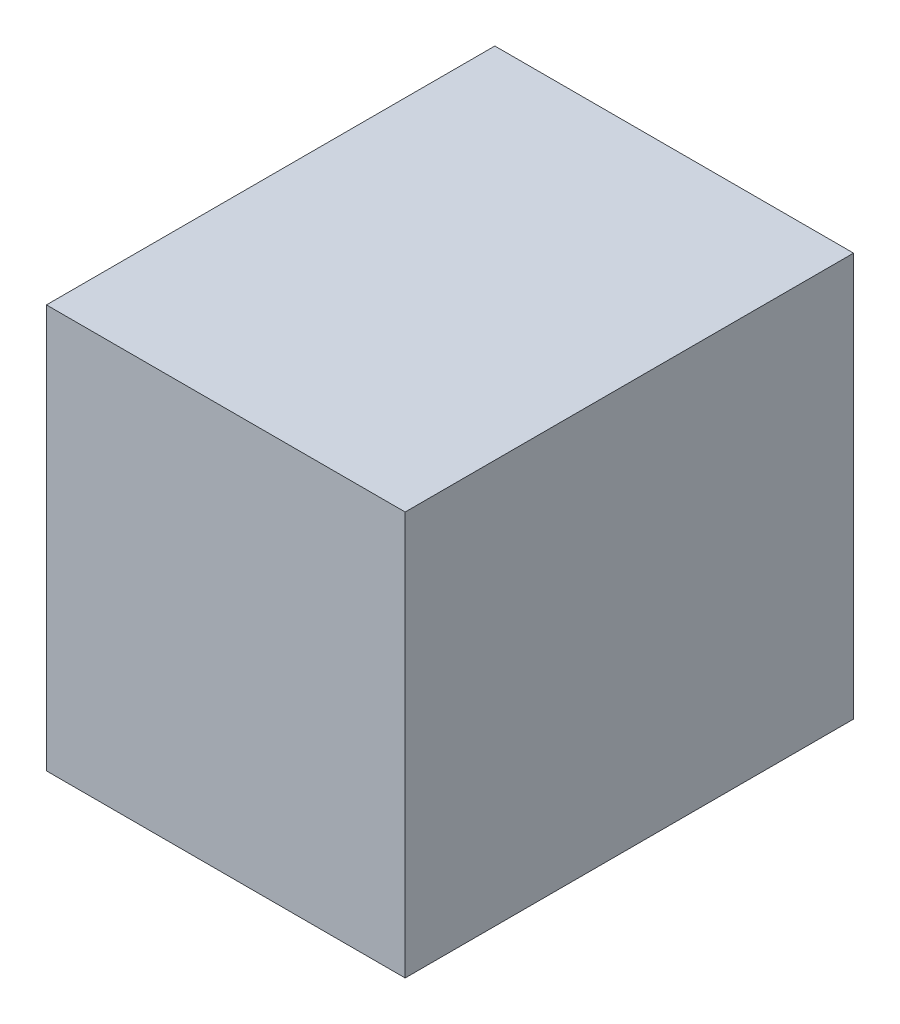
ISO-10303-21;
HEADER;
FILE_DESCRIPTION(('STEP AP214'),'2;1');
FILE_NAME('part.step','',(''),(''),'','','');
FILE_SCHEMA(('AUTOMOTIVE_DESIGN { 1 0 10303 214 1 1 1 1 }'));
ENDSEC;
DATA;
#1=APPLICATION_CONTEXT('core data for automotive mechanical design processes');
#2=APPLICATION_PROTOCOL_DEFINITION('international standard','automotive_design',2000,#1);
#3=PRODUCT_CONTEXT('',#1,'mechanical');
#4=PRODUCT('Part','Part','',(#3));
#5=PRODUCT_RELATED_PRODUCT_CATEGORY('part','',(#4));
#6=PRODUCT_DEFINITION_FORMATION('','',#4);
#7=PRODUCT_DEFINITION_CONTEXT('part definition',#1,'design');
#8=PRODUCT_DEFINITION('design','',#6,#7);
#9=PRODUCT_DEFINITION_SHAPE('','',#8);
#10=(LENGTH_UNIT() NAMED_UNIT(*) SI_UNIT(.MILLI.,.METRE.));
#11=(NAMED_UNIT(*) PLANE_ANGLE_UNIT() SI_UNIT($,.RADIAN.));
#12=(NAMED_UNIT(*) SI_UNIT($,.STERADIAN.) SOLID_ANGLE_UNIT());
#13=UNCERTAINTY_MEASURE_WITH_UNIT(LENGTH_MEASURE(1.E-05),#10,'distance_accuracy_value','');
#14=(GEOMETRIC_REPRESENTATION_CONTEXT(3) GLOBAL_UNCERTAINTY_ASSIGNED_CONTEXT((#13)) GLOBAL_UNIT_ASSIGNED_CONTEXT((#10,
#11,#12)) REPRESENTATION_CONTEXT('',''));
#15=CARTESIAN_POINT('',(0.,0.,0.));
#16=DIRECTION('',(0.,0.,1.));
#17=DIRECTION('',(1.,0.,0.));
#18=AXIS2_PLACEMENT_3D('',#15,#16,#17);
#19=CARTESIAN_POINT('',(0.,0.,500.));
#20=DIRECTION('',(1.,0.,0.));
#21=DIRECTION('',(0.,0.,-1.));
#22=AXIS2_PLACEMENT_3D('',#19,#20,#21);
#23=PLANE('',#22);
#24=DIRECTION('',(0.,-1.,0.));
#25=VECTOR('',#24,1.);
#26=CARTESIAN_POINT('',(0.,0.,0.));
#27=LINE('',#26,#25);
#28=CARTESIAN_POINT('',(0.,450.,0.));
#29=VERTEX_POINT('',#28);
#30=CARTESIAN_POINT('',(0.,0.,0.));
#31=VERTEX_POINT('',#30);
#32=EDGE_CURVE('E111',#29,#31,#27,.T.);
#33=ORIENTED_EDGE('',*,*,#32,.T.);
#34=DIRECTION('',(0.,0.,-1.));
#35=VECTOR('',#34,1.);
#36=CARTESIAN_POINT('',(0.,0.,500.));
#37=LINE('',#36,#35);
#38=CARTESIAN_POINT('',(0.,0.,500.));
#39=VERTEX_POINT('',#38);
#40=EDGE_CURVE('E11',#39,#31,#37,.T.);
#41=ORIENTED_EDGE('',*,*,#40,.F.);
#42=DIRECTION('',(0.,-1.,0.));
#43=VECTOR('',#42,1.);
#44=CARTESIAN_POINT('',(0.,0.,500.));
#45=LINE('',#44,#43);
#46=CARTESIAN_POINT('',(0.,450.,500.));
#47=VERTEX_POINT('',#46);
#48=EDGE_CURVE('E95',#47,#39,#45,.T.);
#49=ORIENTED_EDGE('',*,*,#48,.F.);
#50=DIRECTION('',(0.,0.,-1.));
#51=VECTOR('',#50,1.);
#52=CARTESIAN_POINT('',(0.,450.,500.));
#53=LINE('',#52,#51);
#54=EDGE_CURVE('E107',#47,#29,#53,.T.);
#55=ORIENTED_EDGE('',*,*,#54,.T.);
#56=EDGE_LOOP('',(#33,#41,#49,#55));
#57=FACE_BOUND('',#56,.T.);
#58=ADVANCED_FACE('F43',(#57),#23,.F.);
#59=CARTESIAN_POINT('',(0.,0.,500.));
#60=DIRECTION('',(0.,1.,0.));
#61=DIRECTION('',(0.,0.,1.));
#62=AXIS2_PLACEMENT_3D('',#59,#60,#61);
#63=PLANE('',#62);
#64=DIRECTION('',(1.,0.,0.));
#65=VECTOR('',#64,1.);
#66=CARTESIAN_POINT('',(0.,0.,0.));
#67=LINE('',#66,#65);
#68=CARTESIAN_POINT('',(400.,0.,0.));
#69=VERTEX_POINT('',#68);
#70=EDGE_CURVE('E100',#31,#69,#67,.T.);
#71=ORIENTED_EDGE('',*,*,#70,.T.);
#72=DIRECTION('',(0.,0.,-1.));
#73=VECTOR('',#72,1.);
#74=CARTESIAN_POINT('',(400.,0.,500.));
#75=LINE('',#74,#73);
#76=CARTESIAN_POINT('',(400.,0.,500.));
#77=VERTEX_POINT('',#76);
#78=EDGE_CURVE('E52',#77,#69,#75,.T.);
#79=ORIENTED_EDGE('',*,*,#78,.F.);
#80=DIRECTION('',(1.,0.,0.));
#81=VECTOR('',#80,1.);
#82=CARTESIAN_POINT('',(0.,0.,500.));
#83=LINE('',#82,#81);
#84=EDGE_CURVE('E90',#39,#77,#83,.T.);
#85=ORIENTED_EDGE('',*,*,#84,.F.);
#86=ORIENTED_EDGE('',*,*,#40,.T.);
#87=EDGE_LOOP('',(#71,#79,#85,#86));
#88=FACE_BOUND('',#87,.T.);
#89=ADVANCED_FACE('F99',(#88),#63,.F.);
#90=CARTESIAN_POINT('',(400.,0.,500.));
#91=DIRECTION('',(-1.,0.,0.));
#92=DIRECTION('',(0.,0.,1.));
#93=AXIS2_PLACEMENT_3D('',#90,#91,#92);
#94=PLANE('',#93);
#95=DIRECTION('',(0.,1.,0.));
#96=VECTOR('',#95,1.);
#97=CARTESIAN_POINT('',(400.,0.,0.));
#98=LINE('',#97,#96);
#99=CARTESIAN_POINT('',(400.,450.,0.));
#100=VERTEX_POINT('',#99);
#101=EDGE_CURVE('E77',#69,#100,#98,.T.);
#102=ORIENTED_EDGE('',*,*,#101,.T.);
#103=DIRECTION('',(0.,0.,-1.));
#104=VECTOR('',#103,1.);
#105=CARTESIAN_POINT('',(400.,450.,500.));
#106=LINE('',#105,#104);
#107=CARTESIAN_POINT('',(400.,450.,500.));
#108=VERTEX_POINT('',#107);
#109=EDGE_CURVE('E102',#108,#100,#106,.T.);
#110=ORIENTED_EDGE('',*,*,#109,.F.);
#111=DIRECTION('',(0.,1.,0.));
#112=VECTOR('',#111,1.);
#113=CARTESIAN_POINT('',(400.,0.,500.));
#114=LINE('',#113,#112);
#115=EDGE_CURVE('E93',#77,#108,#114,.T.);
#116=ORIENTED_EDGE('',*,*,#115,.F.);
#117=ORIENTED_EDGE('',*,*,#78,.T.);
#118=EDGE_LOOP('',(#102,#110,#116,#117));
#119=FACE_BOUND('',#118,.T.);
#120=ADVANCED_FACE('F103',(#119),#94,.F.);
#121=CARTESIAN_POINT('',(0.,450.,500.));
#122=DIRECTION('',(0.,-1.,0.));
#123=DIRECTION('',(0.,0.,-1.));
#124=AXIS2_PLACEMENT_3D('',#121,#122,#123);
#125=PLANE('',#124);
#126=DIRECTION('',(-1.,0.,0.));
#127=VECTOR('',#126,1.);
#128=CARTESIAN_POINT('',(0.,450.,0.));
#129=LINE('',#128,#127);
#130=EDGE_CURVE('E83',#100,#29,#129,.T.);
#131=ORIENTED_EDGE('',*,*,#130,.T.);
#132=ORIENTED_EDGE('',*,*,#54,.F.);
#133=DIRECTION('',(-1.,0.,0.));
#134=VECTOR('',#133,1.);
#135=CARTESIAN_POINT('',(0.,450.,500.));
#136=LINE('',#135,#134);
#137=EDGE_CURVE('E60',#108,#47,#136,.T.);
#138=ORIENTED_EDGE('',*,*,#137,.F.);
#139=ORIENTED_EDGE('',*,*,#109,.T.);
#140=EDGE_LOOP('',(#131,#132,#138,#139));
#141=FACE_BOUND('',#140,.T.);
#142=ADVANCED_FACE('F124',(#141),#125,.F.);
#143=CARTESIAN_POINT('',(0.,0.,500.));
#144=DIRECTION('',(0.,0.,-1.));
#145=DIRECTION('',(-1.,0.,0.));
#146=AXIS2_PLACEMENT_3D('',#143,#144,#145);
#147=PLANE('',#146);
#148=ORIENTED_EDGE('',*,*,#48,.T.);
#149=ORIENTED_EDGE('',*,*,#84,.T.);
#150=ORIENTED_EDGE('',*,*,#115,.T.);
#151=ORIENTED_EDGE('',*,*,#137,.T.);
#152=EDGE_LOOP('',(#148,#149,#150,#151));
#153=FACE_BOUND('',#152,.T.);
#154=ADVANCED_FACE('F91',(#153),#147,.F.);
#155=CARTESIAN_POINT('',(0.,0.,0.));
#156=DIRECTION('',(0.,0.,-1.));
#157=DIRECTION('',(-1.,0.,0.));
#158=AXIS2_PLACEMENT_3D('',#155,#156,#157);
#159=PLANE('',#158);
#160=ORIENTED_EDGE('',*,*,#32,.F.);
#161=ORIENTED_EDGE('',*,*,#130,.F.);
#162=ORIENTED_EDGE('',*,*,#101,.F.);
#163=ORIENTED_EDGE('',*,*,#70,.F.);
#164=EDGE_LOOP('',(#160,#161,#162,#163));
#165=FACE_BOUND('',#164,.T.);
#166=ADVANCED_FACE('F127',(#165),#159,.T.);
#167=CLOSED_SHELL('',(#58,#89,#120,#142,#154,#166));
#168=MANIFOLD_SOLID_BREP('B2',#167);
#169=ADVANCED_BREP_SHAPE_REPRESENTATION('',(#18,#168),#14);
#170=SHAPE_DEFINITION_REPRESENTATION(#9,#169);
ENDSEC;
END-ISO-10303-21;
